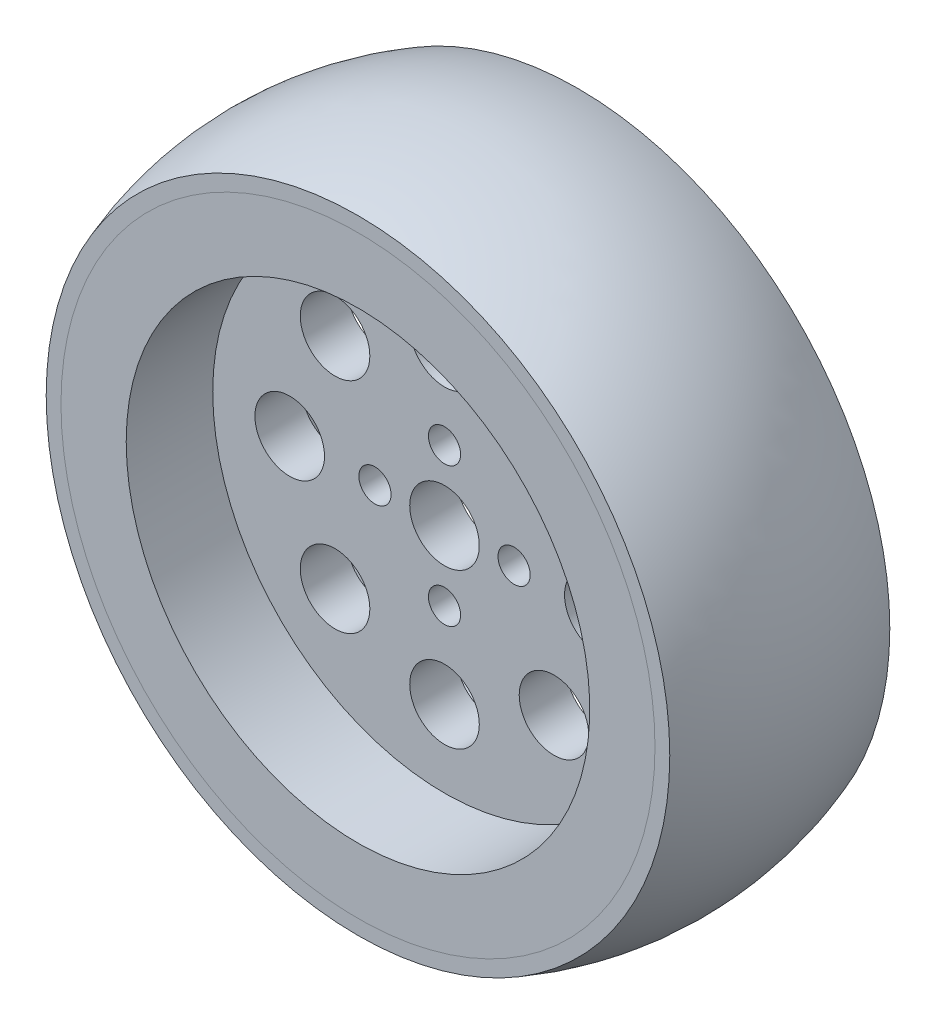
ISO-10303-21;
HEADER;
FILE_DESCRIPTION(('STEP AP214'),'2;1');
FILE_NAME('part.step','',(''),(''),'','','');
FILE_SCHEMA(('AUTOMOTIVE_DESIGN { 1 0 10303 214 1 1 1 1 }'));
ENDSEC;
DATA;
#1=APPLICATION_CONTEXT('core data for automotive mechanical design processes');
#2=APPLICATION_PROTOCOL_DEFINITION('international standard','automotive_design',2000,#1);
#3=PRODUCT_CONTEXT('',#1,'mechanical');
#4=PRODUCT('Part','Part','',(#3));
#5=PRODUCT_RELATED_PRODUCT_CATEGORY('part','',(#4));
#6=PRODUCT_DEFINITION_FORMATION('','',#4);
#7=PRODUCT_DEFINITION_CONTEXT('part definition',#1,'design');
#8=PRODUCT_DEFINITION('design','',#6,#7);
#9=PRODUCT_DEFINITION_SHAPE('','',#8);
#10=(LENGTH_UNIT() NAMED_UNIT(*) SI_UNIT(.MILLI.,.METRE.));
#11=(NAMED_UNIT(*) PLANE_ANGLE_UNIT() SI_UNIT($,.RADIAN.));
#12=(NAMED_UNIT(*) SI_UNIT($,.STERADIAN.) SOLID_ANGLE_UNIT());
#13=UNCERTAINTY_MEASURE_WITH_UNIT(LENGTH_MEASURE(1.E-05),#10,'distance_accuracy_value','');
#14=(GEOMETRIC_REPRESENTATION_CONTEXT(3) GLOBAL_UNCERTAINTY_ASSIGNED_CONTEXT((#13)) GLOBAL_UNIT_ASSIGNED_CONTEXT((#10,
#11,#12)) REPRESENTATION_CONTEXT('',''));
#15=CARTESIAN_POINT('',(0.,0.,0.));
#16=DIRECTION('',(0.,0.,1.));
#17=DIRECTION('',(1.,0.,0.));
#18=AXIS2_PLACEMENT_3D('',#15,#16,#17);
#19=CARTESIAN_POINT('',(34.15,0.,10.65));
#20=DIRECTION('',(0.,0.,-1.));
#21=DIRECTION('',(-1.,0.,0.));
#22=AXIS2_PLACEMENT_3D('',#19,#20,#21);
#23=PLANE('',#22);
#24=CARTESIAN_POINT('',(0.,0.,10.65));
#25=DIRECTION('',(0.,0.,-1.));
#26=DIRECTION('',(-1.,0.,0.));
#27=AXIS2_PLACEMENT_3D('',#24,#25,#26);
#28=CIRCLE('',#27,34.15);
#29=CARTESIAN_POINT('',(-34.15,0.,10.65));
#30=VERTEX_POINT('',#29);
#31=EDGE_CURVE('E68',#30,#30,#28,.T.);
#32=ORIENTED_EDGE('',*,*,#31,.F.);
#33=EDGE_LOOP('',(#32));
#34=FACE_BOUND('',#33,.T.);
#35=CARTESIAN_POINT('',(0.,0.,10.65));
#36=DIRECTION('',(0.,0.,-1.));
#37=DIRECTION('',(-1.,0.,0.));
#38=AXIS2_PLACEMENT_3D('',#35,#36,#37);
#39=CIRCLE('',#38,31.85);
#40=CARTESIAN_POINT('',(-31.85,0.,10.65));
#41=VERTEX_POINT('',#40);
#42=EDGE_CURVE('E11',#41,#41,#39,.T.);
#43=ORIENTED_EDGE('',*,*,#42,.T.);
#44=EDGE_LOOP('',(#43));
#45=FACE_BOUND('',#44,.T.);
#46=ADVANCED_FACE('F40',(#34,#45),#23,.F.);
#47=CARTESIAN_POINT('',(0.,0.,0.));
#48=DIRECTION('',(0.,0.,-1.));
#49=DIRECTION('',(-1.,0.,0.));
#50=AXIS2_PLACEMENT_3D('',#47,#48,#49);
#51=CYLINDRICAL_SURFACE('',#50,31.85);
#52=ORIENTED_EDGE('',*,*,#42,.F.);
#53=EDGE_LOOP('',(#52));
#54=FACE_BOUND('',#53,.T.);
#55=CARTESIAN_POINT('',(0.,0.,-10.65));
#56=DIRECTION('',(0.,0.,-1.));
#57=DIRECTION('',(-1.,0.,0.));
#58=AXIS2_PLACEMENT_3D('',#55,#56,#57);
#59=CIRCLE('',#58,31.85);
#60=CARTESIAN_POINT('',(-31.85,0.,-10.65));
#61=VERTEX_POINT('',#60);
#62=EDGE_CURVE('E46',#61,#61,#59,.T.);
#63=ORIENTED_EDGE('',*,*,#62,.T.);
#64=EDGE_LOOP('',(#63));
#65=FACE_BOUND('',#64,.T.);
#66=ADVANCED_FACE('F75',(#54,#65),#51,.F.);
#67=CARTESIAN_POINT('',(31.85,0.,-10.65));
#68=DIRECTION('',(0.,0.,1.));
#69=DIRECTION('',(1.,0.,0.));
#70=AXIS2_PLACEMENT_3D('',#67,#68,#69);
#71=PLANE('',#70);
#72=ORIENTED_EDGE('',*,*,#62,.F.);
#73=EDGE_LOOP('',(#72));
#74=FACE_BOUND('',#73,.T.);
#75=CARTESIAN_POINT('',(0.,0.,-10.65));
#76=DIRECTION('',(0.,0.,-1.));
#77=DIRECTION('',(-1.,0.,0.));
#78=AXIS2_PLACEMENT_3D('',#75,#76,#77);
#79=CIRCLE('',#78,34.15);
#80=CARTESIAN_POINT('',(-34.15,0.,-10.65));
#81=VERTEX_POINT('',#80);
#82=EDGE_CURVE('E50',#81,#81,#79,.T.);
#83=ORIENTED_EDGE('',*,*,#82,.T.);
#84=EDGE_LOOP('',(#83));
#85=FACE_BOUND('',#84,.T.);
#86=ADVANCED_FACE('F79',(#74,#85),#71,.F.);
#87=CARTESIAN_POINT('',(0.,0.,0.));
#88=DIRECTION('',(0.,0.,-1.));
#89=DIRECTION('',(-1.,0.,0.));
#90=AXIS2_PLACEMENT_3D('',#87,#88,#89);
#91=CYLINDRICAL_SURFACE('',#90,34.15);
#92=ORIENTED_EDGE('',*,*,#82,.F.);
#93=EDGE_LOOP('',(#92));
#94=FACE_BOUND('',#93,.T.);
#95=CARTESIAN_POINT('',(0.,0.,-12.65));
#96=DIRECTION('',(0.,0.,-1.));
#97=DIRECTION('',(-1.,0.,0.));
#98=AXIS2_PLACEMENT_3D('',#95,#96,#97);
#99=CIRCLE('',#98,34.15);
#100=CARTESIAN_POINT('',(-34.15,0.,-12.65));
#101=VERTEX_POINT('',#100);
#102=EDGE_CURVE('E54',#101,#101,#99,.T.);
#103=ORIENTED_EDGE('',*,*,#102,.T.);
#104=EDGE_LOOP('',(#103));
#105=FACE_BOUND('',#104,.T.);
#106=ADVANCED_FACE('F84',(#94,#105),#91,.F.);
#107=CARTESIAN_POINT('',(34.15,0.,-12.65));
#108=DIRECTION('',(0.,0.,1.));
#109=DIRECTION('',(1.,0.,0.));
#110=AXIS2_PLACEMENT_3D('',#107,#108,#109);
#111=PLANE('',#110);
#112=ORIENTED_EDGE('',*,*,#102,.F.);
#113=EDGE_LOOP('',(#112));
#114=FACE_BOUND('',#113,.T.);
#115=CARTESIAN_POINT('',(0.,0.,-12.65));
#116=DIRECTION('',(0.,0.,-1.));
#117=DIRECTION('',(-1.,0.,0.));
#118=AXIS2_PLACEMENT_3D('',#115,#116,#117);
#119=CIRCLE('',#118,35.85);
#120=CARTESIAN_POINT('',(-35.85,0.,-12.65));
#121=VERTEX_POINT('',#120);
#122=EDGE_CURVE('E59',#121,#121,#119,.T.);
#123=ORIENTED_EDGE('',*,*,#122,.T.);
#124=EDGE_LOOP('',(#123));
#125=FACE_BOUND('',#124,.T.);
#126=ADVANCED_FACE('F90',(#114,#125),#111,.F.);
#127=CARTESIAN_POINT('',(0.,0.,0.));
#128=DIRECTION('',(0.,0.,-1.));
#129=DIRECTION('',(-1.,0.,0.));
#130=AXIS2_PLACEMENT_3D('',#127,#128,#129);
#131=DEGENERATE_TOROIDAL_SURFACE('',#130,1.41444444444449,36.6855555555555,.T.);
#132=ORIENTED_EDGE('',*,*,#122,.F.);
#133=EDGE_LOOP('',(#132));
#134=FACE_BOUND('',#133,.T.);
#135=CARTESIAN_POINT('',(0.,0.,12.65));
#136=DIRECTION('',(0.,0.,-1.));
#137=DIRECTION('',(-1.,0.,0.));
#138=AXIS2_PLACEMENT_3D('',#135,#136,#137);
#139=CIRCLE('',#138,35.85);
#140=CARTESIAN_POINT('',(-35.85,0.,12.65));
#141=VERTEX_POINT('',#140);
#142=EDGE_CURVE('E62',#141,#141,#139,.T.);
#143=ORIENTED_EDGE('',*,*,#142,.T.);
#144=EDGE_LOOP('',(#143));
#145=FACE_BOUND('',#144,.T.);
#146=ADVANCED_FACE('F94',(#134,#145),#131,.T.);
#147=CARTESIAN_POINT('',(34.15,0.,12.65));
#148=DIRECTION('',(0.,0.,-1.));
#149=DIRECTION('',(-1.,0.,0.));
#150=AXIS2_PLACEMENT_3D('',#147,#148,#149);
#151=PLANE('',#150);
#152=ORIENTED_EDGE('',*,*,#142,.F.);
#153=EDGE_LOOP('',(#152));
#154=FACE_BOUND('',#153,.T.);
#155=CARTESIAN_POINT('',(0.,0.,12.65));
#156=DIRECTION('',(0.,0.,-1.));
#157=DIRECTION('',(-1.,0.,0.));
#158=AXIS2_PLACEMENT_3D('',#155,#156,#157);
#159=CIRCLE('',#158,34.15);
#160=CARTESIAN_POINT('',(-34.15,0.,12.65));
#161=VERTEX_POINT('',#160);
#162=EDGE_CURVE('E65',#161,#161,#159,.T.);
#163=ORIENTED_EDGE('',*,*,#162,.T.);
#164=EDGE_LOOP('',(#163));
#165=FACE_BOUND('',#164,.T.);
#166=ADVANCED_FACE('F98',(#154,#165),#151,.F.);
#167=CARTESIAN_POINT('',(0.,0.,0.));
#168=DIRECTION('',(0.,0.,-1.));
#169=DIRECTION('',(-1.,0.,0.));
#170=AXIS2_PLACEMENT_3D('',#167,#168,#169);
#171=CYLINDRICAL_SURFACE('',#170,34.15);
#172=ORIENTED_EDGE('',*,*,#162,.F.);
#173=EDGE_LOOP('',(#172));
#174=FACE_BOUND('',#173,.T.);
#175=ORIENTED_EDGE('',*,*,#31,.T.);
#176=EDGE_LOOP('',(#175));
#177=FACE_BOUND('',#176,.T.);
#178=ADVANCED_FACE('F72',(#174,#177),#171,.F.);
#179=CLOSED_SHELL('',(#46,#66,#86,#106,#126,#146,#166,#178));
#180=MANIFOLD_SOLID_BREP('B2',#179);
#181=CARTESIAN_POINT('',(26.65,0.,-2.7));
#182=DIRECTION('',(0.,0.,1.));
#183=DIRECTION('',(1.,0.,0.));
#184=AXIS2_PLACEMENT_3D('',#181,#182,#183);
#185=PLANE('',#184);
#186=CARTESIAN_POINT('',(-12.5865007051206,12.5865007051205,-2.69999999999999));
#187=DIRECTION('',(0.,0.,1.));
#188=DIRECTION('',(1.,0.,0.));
#189=AXIS2_PLACEMENT_3D('',#186,#187,#188);
#190=CIRCLE('',#189,4.);
#191=CARTESIAN_POINT('',(-8.58650070512062,12.5865007051205,-2.69999999999999));
#192=VERTEX_POINT('',#191);
#193=EDGE_CURVE('E219',#192,#192,#190,.T.);
#194=ORIENTED_EDGE('',*,*,#193,.T.);
#195=EDGE_LOOP('',(#194));
#196=FACE_BOUND('',#195,.T.);
#197=CARTESIAN_POINT('',(-17.8,0.,-2.69999999999999));
#198=DIRECTION('',(0.,0.,1.));
#199=DIRECTION('',(1.,0.,0.));
#200=AXIS2_PLACEMENT_3D('',#197,#198,#199);
#201=CIRCLE('',#200,4.);
#202=CARTESIAN_POINT('',(-13.8,0.,-2.69999999999999));
#203=VERTEX_POINT('',#202);
#204=EDGE_CURVE('E216',#203,#203,#201,.T.);
#205=ORIENTED_EDGE('',*,*,#204,.T.);
#206=EDGE_LOOP('',(#205));
#207=FACE_BOUND('',#206,.T.);
#208=CARTESIAN_POINT('',(-12.5865007051205,-12.5865007051206,-2.69999999999999));
#209=DIRECTION('',(0.,0.,1.));
#210=DIRECTION('',(1.,0.,0.));
#211=AXIS2_PLACEMENT_3D('',#208,#209,#210);
#212=CIRCLE('',#211,4.);
#213=CARTESIAN_POINT('',(-8.58650070512048,-12.5865007051206,-2.69999999999999));
#214=VERTEX_POINT('',#213);
#215=EDGE_CURVE('E213',#214,#214,#212,.T.);
#216=ORIENTED_EDGE('',*,*,#215,.T.);
#217=EDGE_LOOP('',(#216));
#218=FACE_BOUND('',#217,.T.);
#219=CARTESIAN_POINT('',(0.,-17.8,-2.69999999999999));
#220=DIRECTION('',(0.,0.,1.));
#221=DIRECTION('',(1.,0.,0.));
#222=AXIS2_PLACEMENT_3D('',#219,#220,#221);
#223=CIRCLE('',#222,4.);
#224=CARTESIAN_POINT('',(4.,-17.8,-2.7));
#225=VERTEX_POINT('',#224);
#226=EDGE_CURVE('E209',#225,#225,#223,.T.);
#227=ORIENTED_EDGE('',*,*,#226,.T.);
#228=EDGE_LOOP('',(#227));
#229=FACE_BOUND('',#228,.T.);
#230=CARTESIAN_POINT('',(12.5865007051206,-12.5865007051205,-2.7));
#231=DIRECTION('',(0.,0.,1.));
#232=DIRECTION('',(1.,0.,0.));
#233=AXIS2_PLACEMENT_3D('',#230,#231,#232);
#234=CIRCLE('',#233,4.);
#235=CARTESIAN_POINT('',(16.5865007051206,-12.5865007051205,-2.7));
#236=VERTEX_POINT('',#235);
#237=EDGE_CURVE('E205',#236,#236,#234,.T.);
#238=ORIENTED_EDGE('',*,*,#237,.T.);
#239=EDGE_LOOP('',(#238));
#240=FACE_BOUND('',#239,.T.);
#241=CARTESIAN_POINT('',(17.8,0.,-2.7));
#242=DIRECTION('',(0.,0.,1.));
#243=DIRECTION('',(1.,0.,0.));
#244=AXIS2_PLACEMENT_3D('',#241,#242,#243);
#245=CIRCLE('',#244,4.);
#246=CARTESIAN_POINT('',(21.8,0.,-2.7));
#247=VERTEX_POINT('',#246);
#248=EDGE_CURVE('E201',#247,#247,#245,.T.);
#249=ORIENTED_EDGE('',*,*,#248,.T.);
#250=EDGE_LOOP('',(#249));
#251=FACE_BOUND('',#250,.T.);
#252=CARTESIAN_POINT('',(12.5865007051205,12.5865007051206,-2.7));
#253=DIRECTION('',(0.,0.,1.));
#254=DIRECTION('',(1.,0.,0.));
#255=AXIS2_PLACEMENT_3D('',#252,#253,#254);
#256=CIRCLE('',#255,3.99999999999999);
#257=CARTESIAN_POINT('',(16.5865007051205,12.5865007051206,-2.7));
#258=VERTEX_POINT('',#257);
#259=EDGE_CURVE('E197',#258,#258,#256,.T.);
#260=ORIENTED_EDGE('',*,*,#259,.T.);
#261=EDGE_LOOP('',(#260));
#262=FACE_BOUND('',#261,.T.);
#263=CARTESIAN_POINT('',(0.,17.8,-2.69999999999999));
#264=DIRECTION('',(0.,0.,1.));
#265=DIRECTION('',(1.,0.,0.));
#266=AXIS2_PLACEMENT_3D('',#263,#264,#265);
#267=CIRCLE('',#266,4.);
#268=CARTESIAN_POINT('',(4.,17.8,-2.7));
#269=VERTEX_POINT('',#268);
#270=EDGE_CURVE('E193',#269,#269,#267,.T.);
#271=ORIENTED_EDGE('',*,*,#270,.T.);
#272=EDGE_LOOP('',(#271));
#273=FACE_BOUND('',#272,.T.);
#274=CARTESIAN_POINT('',(-8.,0.,-2.69999999999999));
#275=DIRECTION('',(0.,0.,1.));
#276=DIRECTION('',(1.,0.,0.));
#277=AXIS2_PLACEMENT_3D('',#274,#275,#276);
#278=CIRCLE('',#277,1.85);
#279=CARTESIAN_POINT('',(-6.15,0.,-2.69999999999999));
#280=VERTEX_POINT('',#279);
#281=EDGE_CURVE('E189',#280,#280,#278,.T.);
#282=ORIENTED_EDGE('',*,*,#281,.T.);
#283=EDGE_LOOP('',(#282));
#284=FACE_BOUND('',#283,.T.);
#285=CARTESIAN_POINT('',(0.,-8.,-2.69999999999999));
#286=DIRECTION('',(0.,0.,1.));
#287=DIRECTION('',(1.,0.,0.));
#288=AXIS2_PLACEMENT_3D('',#285,#286,#287);
#289=CIRCLE('',#288,1.85);
#290=CARTESIAN_POINT('',(1.85,-8.,-2.69999999999999));
#291=VERTEX_POINT('',#290);
#292=EDGE_CURVE('E185',#291,#291,#289,.T.);
#293=ORIENTED_EDGE('',*,*,#292,.T.);
#294=EDGE_LOOP('',(#293));
#295=FACE_BOUND('',#294,.T.);
#296=CARTESIAN_POINT('',(8.,0.,-2.7));
#297=DIRECTION('',(0.,0.,1.));
#298=DIRECTION('',(1.,0.,0.));
#299=AXIS2_PLACEMENT_3D('',#296,#297,#298);
#300=CIRCLE('',#299,1.85);
#301=CARTESIAN_POINT('',(9.85,0.,-2.7));
#302=VERTEX_POINT('',#301);
#303=EDGE_CURVE('E181',#302,#302,#300,.T.);
#304=ORIENTED_EDGE('',*,*,#303,.T.);
#305=EDGE_LOOP('',(#304));
#306=FACE_BOUND('',#305,.T.);
#307=CARTESIAN_POINT('',(0.,8.,-2.69999999999999));
#308=DIRECTION('',(0.,0.,1.));
#309=DIRECTION('',(1.,0.,0.));
#310=AXIS2_PLACEMENT_3D('',#307,#308,#309);
#311=CIRCLE('',#310,1.85);
#312=CARTESIAN_POINT('',(1.85,8.,-2.69999999999999));
#313=VERTEX_POINT('',#312);
#314=EDGE_CURVE('E180',#313,#313,#311,.T.);
#315=ORIENTED_EDGE('',*,*,#314,.T.);
#316=EDGE_LOOP('',(#315));
#317=FACE_BOUND('',#316,.T.);
#318=CARTESIAN_POINT('',(0.,0.,-2.7));
#319=DIRECTION('',(0.,0.,-1.));
#320=DIRECTION('',(-1.,0.,0.));
#321=AXIS2_PLACEMENT_3D('',#318,#319,#320);
#322=CIRCLE('',#321,4.);
#323=CARTESIAN_POINT('',(-4.00000000000001,0.,-2.69999999999999));
#324=VERTEX_POINT('',#323);
#325=EDGE_CURVE('E39',#324,#324,#322,.T.);
#326=ORIENTED_EDGE('',*,*,#325,.F.);
#327=EDGE_LOOP('',(#326));
#328=FACE_BOUND('',#327,.T.);
#329=CARTESIAN_POINT('',(0.,0.,-2.69999999999999));
#330=DIRECTION('',(0.,0.,-1.));
#331=DIRECTION('',(-1.,0.,0.));
#332=AXIS2_PLACEMENT_3D('',#329,#330,#331);
#333=CIRCLE('',#332,26.65);
#334=CARTESIAN_POINT('',(-26.65,0.,-2.69999999999998));
#335=VERTEX_POINT('',#334);
#336=EDGE_CURVE('E250',#335,#335,#333,.T.);
#337=ORIENTED_EDGE('',*,*,#336,.T.);
#338=EDGE_LOOP('',(#337));
#339=FACE_BOUND('',#338,.T.);
#340=ADVANCED_FACE('F161',(#196,#207,#218,#229,#240,#251,#262,#273,#284,#295,#306,#317,#328,
#339),#185,.F.);
#341=CARTESIAN_POINT('',(0.,0.,-12.65));
#342=DIRECTION('',(0.,0.,-1.));
#343=DIRECTION('',(-1.,0.,0.));
#344=AXIS2_PLACEMENT_3D('',#341,#342,#343);
#345=CYLINDRICAL_SURFACE('',#344,4.);
#346=CARTESIAN_POINT('',(0.,0.,2.7));
#347=DIRECTION('',(0.,0.,-1.));
#348=DIRECTION('',(-1.,0.,0.));
#349=AXIS2_PLACEMENT_3D('',#346,#347,#348);
#350=CIRCLE('',#349,4.);
#351=CARTESIAN_POINT('',(-4.,0.,2.7));
#352=VERTEX_POINT('',#351);
#353=EDGE_CURVE('E168',#352,#352,#350,.T.);
#354=ORIENTED_EDGE('',*,*,#353,.F.);
#355=EDGE_LOOP('',(#354));
#356=FACE_BOUND('',#355,.T.);
#357=ORIENTED_EDGE('',*,*,#325,.T.);
#358=EDGE_LOOP('',(#357));
#359=FACE_BOUND('',#358,.T.);
#360=ADVANCED_FACE('F284',(#356,#359),#345,.F.);
#361=CARTESIAN_POINT('',(4.,0.,2.7));
#362=DIRECTION('',(0.,0.,-1.));
#363=DIRECTION('',(-1.,0.,0.));
#364=AXIS2_PLACEMENT_3D('',#361,#362,#363);
#365=PLANE('',#364);
#366=CARTESIAN_POINT('',(-12.5865007051206,12.5865007051205,2.70000000000001));
#367=DIRECTION('',(0.,0.,-1.));
#368=DIRECTION('',(-1.,0.,0.));
#369=AXIS2_PLACEMENT_3D('',#366,#367,#368);
#370=CIRCLE('',#369,4.);
#371=CARTESIAN_POINT('',(-16.5865007051206,12.5865007051205,2.70000000000001));
#372=VERTEX_POINT('',#371);
#373=EDGE_CURVE('E164',#372,#372,#370,.T.);
#374=ORIENTED_EDGE('',*,*,#373,.T.);
#375=EDGE_LOOP('',(#374));
#376=FACE_BOUND('',#375,.T.);
#377=CARTESIAN_POINT('',(-17.8,0.,2.70000000000001));
#378=DIRECTION('',(0.,0.,-1.));
#379=DIRECTION('',(-1.,0.,0.));
#380=AXIS2_PLACEMENT_3D('',#377,#378,#379);
#381=CIRCLE('',#380,4.);
#382=CARTESIAN_POINT('',(-21.8,0.,2.70000000000001));
#383=VERTEX_POINT('',#382);
#384=EDGE_CURVE('E217',#383,#383,#381,.T.);
#385=ORIENTED_EDGE('',*,*,#384,.T.);
#386=EDGE_LOOP('',(#385));
#387=FACE_BOUND('',#386,.T.);
#388=CARTESIAN_POINT('',(-12.5865007051205,-12.5865007051206,2.70000000000001));
#389=DIRECTION('',(0.,0.,-1.));
#390=DIRECTION('',(-1.,0.,0.));
#391=AXIS2_PLACEMENT_3D('',#388,#389,#390);
#392=CIRCLE('',#391,4.);
#393=CARTESIAN_POINT('',(-16.5865007051205,-12.5865007051206,2.70000000000001));
#394=VERTEX_POINT('',#393);
#395=EDGE_CURVE('E214',#394,#394,#392,.T.);
#396=ORIENTED_EDGE('',*,*,#395,.T.);
#397=EDGE_LOOP('',(#396));
#398=FACE_BOUND('',#397,.T.);
#399=CARTESIAN_POINT('',(0.,-17.8,2.7));
#400=DIRECTION('',(0.,0.,-1.));
#401=DIRECTION('',(-1.,0.,0.));
#402=AXIS2_PLACEMENT_3D('',#399,#400,#401);
#403=CIRCLE('',#402,4.);
#404=CARTESIAN_POINT('',(-4.,-17.8,2.70000000000001));
#405=VERTEX_POINT('',#404);
#406=EDGE_CURVE('E210',#405,#405,#403,.T.);
#407=ORIENTED_EDGE('',*,*,#406,.T.);
#408=EDGE_LOOP('',(#407));
#409=FACE_BOUND('',#408,.T.);
#410=CARTESIAN_POINT('',(12.5865007051206,-12.5865007051205,2.7));
#411=DIRECTION('',(0.,0.,-1.));
#412=DIRECTION('',(-1.,0.,0.));
#413=AXIS2_PLACEMENT_3D('',#410,#411,#412);
#414=CIRCLE('',#413,4.);
#415=CARTESIAN_POINT('',(8.58650070512061,-12.5865007051205,2.7));
#416=VERTEX_POINT('',#415);
#417=EDGE_CURVE('E206',#416,#416,#414,.T.);
#418=ORIENTED_EDGE('',*,*,#417,.T.);
#419=EDGE_LOOP('',(#418));
#420=FACE_BOUND('',#419,.T.);
#421=CARTESIAN_POINT('',(17.8,0.,2.7));
#422=DIRECTION('',(0.,0.,-1.));
#423=DIRECTION('',(-1.,0.,0.));
#424=AXIS2_PLACEMENT_3D('',#421,#422,#423);
#425=CIRCLE('',#424,4.);
#426=CARTESIAN_POINT('',(13.8,0.,2.7));
#427=VERTEX_POINT('',#426);
#428=EDGE_CURVE('E202',#427,#427,#425,.T.);
#429=ORIENTED_EDGE('',*,*,#428,.T.);
#430=EDGE_LOOP('',(#429));
#431=FACE_BOUND('',#430,.T.);
#432=CARTESIAN_POINT('',(12.5865007051205,12.5865007051206,2.7));
#433=DIRECTION('',(0.,0.,-1.));
#434=DIRECTION('',(-1.,0.,0.));
#435=AXIS2_PLACEMENT_3D('',#432,#433,#434);
#436=CIRCLE('',#435,3.99999999999999);
#437=CARTESIAN_POINT('',(8.58650070512047,12.5865007051206,2.7));
#438=VERTEX_POINT('',#437);
#439=EDGE_CURVE('E198',#438,#438,#436,.T.);
#440=ORIENTED_EDGE('',*,*,#439,.T.);
#441=EDGE_LOOP('',(#440));
#442=FACE_BOUND('',#441,.T.);
#443=CARTESIAN_POINT('',(0.,17.8,2.7));
#444=DIRECTION('',(0.,0.,-1.));
#445=DIRECTION('',(-1.,0.,0.));
#446=AXIS2_PLACEMENT_3D('',#443,#444,#445);
#447=CIRCLE('',#446,4.);
#448=CARTESIAN_POINT('',(-4.,17.8,2.70000000000001));
#449=VERTEX_POINT('',#448);
#450=EDGE_CURVE('E194',#449,#449,#447,.T.);
#451=ORIENTED_EDGE('',*,*,#450,.T.);
#452=EDGE_LOOP('',(#451));
#453=FACE_BOUND('',#452,.T.);
#454=CARTESIAN_POINT('',(-8.,0.,2.70000000000001));
#455=DIRECTION('',(0.,0.,-1.));
#456=DIRECTION('',(-1.,0.,0.));
#457=AXIS2_PLACEMENT_3D('',#454,#455,#456);
#458=CIRCLE('',#457,1.85);
#459=CARTESIAN_POINT('',(-9.85,0.,2.70000000000001));
#460=VERTEX_POINT('',#459);
#461=EDGE_CURVE('E190',#460,#460,#458,.T.);
#462=ORIENTED_EDGE('',*,*,#461,.T.);
#463=EDGE_LOOP('',(#462));
#464=FACE_BOUND('',#463,.T.);
#465=CARTESIAN_POINT('',(0.,-8.,2.7));
#466=DIRECTION('',(0.,0.,-1.));
#467=DIRECTION('',(-1.,0.,0.));
#468=AXIS2_PLACEMENT_3D('',#465,#466,#467);
#469=CIRCLE('',#468,1.85);
#470=CARTESIAN_POINT('',(-1.85,-8.,2.70000000000001));
#471=VERTEX_POINT('',#470);
#472=EDGE_CURVE('E186',#471,#471,#469,.T.);
#473=ORIENTED_EDGE('',*,*,#472,.T.);
#474=EDGE_LOOP('',(#473));
#475=FACE_BOUND('',#474,.T.);
#476=CARTESIAN_POINT('',(8.,0.,2.7));
#477=DIRECTION('',(0.,0.,-1.));
#478=DIRECTION('',(-1.,0.,0.));
#479=AXIS2_PLACEMENT_3D('',#476,#477,#478);
#480=CIRCLE('',#479,1.85);
#481=CARTESIAN_POINT('',(6.15,0.,2.7));
#482=VERTEX_POINT('',#481);
#483=EDGE_CURVE('E182',#482,#482,#480,.T.);
#484=ORIENTED_EDGE('',*,*,#483,.T.);
#485=EDGE_LOOP('',(#484));
#486=FACE_BOUND('',#485,.T.);
#487=CARTESIAN_POINT('',(0.,8.,2.7));
#488=DIRECTION('',(0.,0.,-1.));
#489=DIRECTION('',(-1.,0.,0.));
#490=AXIS2_PLACEMENT_3D('',#487,#488,#489);
#491=CIRCLE('',#490,1.85);
#492=CARTESIAN_POINT('',(-1.85,8.,2.70000000000001));
#493=VERTEX_POINT('',#492);
#494=EDGE_CURVE('E177',#493,#493,#491,.T.);
#495=ORIENTED_EDGE('',*,*,#494,.T.);
#496=EDGE_LOOP('',(#495));
#497=FACE_BOUND('',#496,.T.);
#498=CARTESIAN_POINT('',(0.,0.,2.70000000000001));
#499=DIRECTION('',(0.,0.,-1.));
#500=DIRECTION('',(-1.,0.,0.));
#501=AXIS2_PLACEMENT_3D('',#498,#499,#500);
#502=CIRCLE('',#501,26.65);
#503=CARTESIAN_POINT('',(-26.65,0.,2.70000000000002));
#504=VERTEX_POINT('',#503);
#505=EDGE_CURVE('E173',#504,#504,#502,.T.);
#506=ORIENTED_EDGE('',*,*,#505,.F.);
#507=EDGE_LOOP('',(#506));
#508=FACE_BOUND('',#507,.T.);
#509=ORIENTED_EDGE('',*,*,#353,.T.);
#510=EDGE_LOOP('',(#509));
#511=FACE_BOUND('',#510,.T.);
#512=ADVANCED_FACE('F281',(#376,#387,#398,#409,#420,#431,#442,#453,#464,#475,#486,#497,#508,
#511),#365,.F.);
#513=CARTESIAN_POINT('',(0.,0.,-12.65));
#514=DIRECTION('',(0.,0.,-1.));
#515=DIRECTION('',(-1.,0.,0.));
#516=AXIS2_PLACEMENT_3D('',#513,#514,#515);
#517=CYLINDRICAL_SURFACE('',#516,26.65);
#518=CARTESIAN_POINT('',(0.,0.,12.65));
#519=DIRECTION('',(0.,0.,-1.));
#520=DIRECTION('',(-1.,0.,0.));
#521=AXIS2_PLACEMENT_3D('',#518,#519,#520);
#522=CIRCLE('',#521,26.65);
#523=CARTESIAN_POINT('',(-26.65,0.,12.65));
#524=VERTEX_POINT('',#523);
#525=EDGE_CURVE('E274',#524,#524,#522,.T.);
#526=ORIENTED_EDGE('',*,*,#525,.F.);
#527=EDGE_LOOP('',(#526));
#528=FACE_BOUND('',#527,.T.);
#529=ORIENTED_EDGE('',*,*,#505,.T.);
#530=EDGE_LOOP('',(#529));
#531=FACE_BOUND('',#530,.T.);
#532=ADVANCED_FACE('F279',(#528,#531),#517,.F.);
#533=CARTESIAN_POINT('',(26.65,0.,12.65));
#534=DIRECTION('',(0.,0.,-1.));
#535=DIRECTION('',(-1.,0.,0.));
#536=AXIS2_PLACEMENT_3D('',#533,#534,#535);
#537=PLANE('',#536);
#538=CARTESIAN_POINT('',(0.,0.,12.65));
#539=DIRECTION('',(0.,0.,-1.));
#540=DIRECTION('',(-1.,0.,0.));
#541=AXIS2_PLACEMENT_3D('',#538,#539,#540);
#542=CIRCLE('',#541,34.15);
#543=CARTESIAN_POINT('',(-34.15,0.,12.65));
#544=VERTEX_POINT('',#543);
#545=EDGE_CURVE('E271',#544,#544,#542,.T.);
#546=ORIENTED_EDGE('',*,*,#545,.F.);
#547=EDGE_LOOP('',(#546));
#548=FACE_BOUND('',#547,.T.);
#549=ORIENTED_EDGE('',*,*,#525,.T.);
#550=EDGE_LOOP('',(#549));
#551=FACE_BOUND('',#550,.T.);
#552=ADVANCED_FACE('F296',(#548,#551),#537,.F.);
#553=CARTESIAN_POINT('',(0.,0.,-12.65));
#554=DIRECTION('',(0.,0.,-1.));
#555=DIRECTION('',(-1.,0.,0.));
#556=AXIS2_PLACEMENT_3D('',#553,#554,#555);
#557=CYLINDRICAL_SURFACE('',#556,34.15);
#558=CARTESIAN_POINT('',(0.,0.,10.65));
#559=DIRECTION('',(0.,0.,-1.));
#560=DIRECTION('',(-1.,0.,0.));
#561=AXIS2_PLACEMENT_3D('',#558,#559,#560);
#562=CIRCLE('',#561,34.15);
#563=CARTESIAN_POINT('',(-34.15,0.,10.65));
#564=VERTEX_POINT('',#563);
#565=EDGE_CURVE('E268',#564,#564,#562,.T.);
#566=ORIENTED_EDGE('',*,*,#565,.F.);
#567=EDGE_LOOP('',(#566));
#568=FACE_BOUND('',#567,.T.);
#569=ORIENTED_EDGE('',*,*,#545,.T.);
#570=EDGE_LOOP('',(#569));
#571=FACE_BOUND('',#570,.T.);
#572=ADVANCED_FACE('F300',(#568,#571),#557,.T.);
#573=CARTESIAN_POINT('',(34.15,0.,10.65));
#574=DIRECTION('',(0.,0.,1.));
#575=DIRECTION('',(1.,0.,0.));
#576=AXIS2_PLACEMENT_3D('',#573,#574,#575);
#577=PLANE('',#576);
#578=CARTESIAN_POINT('',(0.,0.,10.65));
#579=DIRECTION('',(0.,0.,-1.));
#580=DIRECTION('',(-1.,0.,0.));
#581=AXIS2_PLACEMENT_3D('',#578,#579,#580);
#582=CIRCLE('',#581,31.85);
#583=CARTESIAN_POINT('',(-31.85,0.,10.65));
#584=VERTEX_POINT('',#583);
#585=EDGE_CURVE('E265',#584,#584,#582,.T.);
#586=ORIENTED_EDGE('',*,*,#585,.F.);
#587=EDGE_LOOP('',(#586));
#588=FACE_BOUND('',#587,.T.);
#589=ORIENTED_EDGE('',*,*,#565,.T.);
#590=EDGE_LOOP('',(#589));
#591=FACE_BOUND('',#590,.T.);
#592=ADVANCED_FACE('F304',(#588,#591),#577,.F.);
#593=CARTESIAN_POINT('',(0.,0.,-12.65));
#594=DIRECTION('',(0.,0.,-1.));
#595=DIRECTION('',(-1.,0.,0.));
#596=AXIS2_PLACEMENT_3D('',#593,#594,#595);
#597=CYLINDRICAL_SURFACE('',#596,31.85);
#598=CARTESIAN_POINT('',(0.,0.,-10.65));
#599=DIRECTION('',(0.,0.,-1.));
#600=DIRECTION('',(-1.,0.,0.));
#601=AXIS2_PLACEMENT_3D('',#598,#599,#600);
#602=CIRCLE('',#601,31.85);
#603=CARTESIAN_POINT('',(-31.85,0.,-10.65));
#604=VERTEX_POINT('',#603);
#605=EDGE_CURVE('E262',#604,#604,#602,.T.);
#606=ORIENTED_EDGE('',*,*,#605,.F.);
#607=EDGE_LOOP('',(#606));
#608=FACE_BOUND('',#607,.T.);
#609=ORIENTED_EDGE('',*,*,#585,.T.);
#610=EDGE_LOOP('',(#609));
#611=FACE_BOUND('',#610,.T.);
#612=ADVANCED_FACE('F308',(#608,#611),#597,.T.);
#613=CARTESIAN_POINT('',(31.85,0.,-10.65));
#614=DIRECTION('',(0.,0.,-1.));
#615=DIRECTION('',(-1.,0.,0.));
#616=AXIS2_PLACEMENT_3D('',#613,#614,#615);
#617=PLANE('',#616);
#618=CARTESIAN_POINT('',(0.,0.,-10.65));
#619=DIRECTION('',(0.,0.,-1.));
#620=DIRECTION('',(-1.,0.,0.));
#621=AXIS2_PLACEMENT_3D('',#618,#619,#620);
#622=CIRCLE('',#621,34.15);
#623=CARTESIAN_POINT('',(-34.15,0.,-10.65));
#624=VERTEX_POINT('',#623);
#625=EDGE_CURVE('E259',#624,#624,#622,.T.);
#626=ORIENTED_EDGE('',*,*,#625,.F.);
#627=EDGE_LOOP('',(#626));
#628=FACE_BOUND('',#627,.T.);
#629=ORIENTED_EDGE('',*,*,#605,.T.);
#630=EDGE_LOOP('',(#629));
#631=FACE_BOUND('',#630,.T.);
#632=ADVANCED_FACE('F312',(#628,#631),#617,.F.);
#633=CARTESIAN_POINT('',(0.,0.,-12.65));
#634=DIRECTION('',(0.,0.,-1.));
#635=DIRECTION('',(-1.,0.,0.));
#636=AXIS2_PLACEMENT_3D('',#633,#634,#635);
#637=CYLINDRICAL_SURFACE('',#636,34.15);
#638=CARTESIAN_POINT('',(0.,0.,-12.65));
#639=DIRECTION('',(0.,0.,-1.));
#640=DIRECTION('',(-1.,0.,0.));
#641=AXIS2_PLACEMENT_3D('',#638,#639,#640);
#642=CIRCLE('',#641,34.15);
#643=CARTESIAN_POINT('',(-34.15,0.,-12.65));
#644=VERTEX_POINT('',#643);
#645=EDGE_CURVE('E256',#644,#644,#642,.T.);
#646=ORIENTED_EDGE('',*,*,#645,.F.);
#647=EDGE_LOOP('',(#646));
#648=FACE_BOUND('',#647,.T.);
#649=ORIENTED_EDGE('',*,*,#625,.T.);
#650=EDGE_LOOP('',(#649));
#651=FACE_BOUND('',#650,.T.);
#652=ADVANCED_FACE('F316',(#648,#651),#637,.T.);
#653=CARTESIAN_POINT('',(34.15,0.,-12.65));
#654=DIRECTION('',(0.,0.,1.));
#655=DIRECTION('',(1.,0.,0.));
#656=AXIS2_PLACEMENT_3D('',#653,#654,#655);
#657=PLANE('',#656);
#658=CARTESIAN_POINT('',(0.,0.,-12.65));
#659=DIRECTION('',(0.,0.,-1.));
#660=DIRECTION('',(-1.,0.,0.));
#661=AXIS2_PLACEMENT_3D('',#658,#659,#660);
#662=CIRCLE('',#661,26.65);
#663=CARTESIAN_POINT('',(-26.65,0.,-12.65));
#664=VERTEX_POINT('',#663);
#665=EDGE_CURVE('E253',#664,#664,#662,.T.);
#666=ORIENTED_EDGE('',*,*,#665,.F.);
#667=EDGE_LOOP('',(#666));
#668=FACE_BOUND('',#667,.T.);
#669=ORIENTED_EDGE('',*,*,#645,.T.);
#670=EDGE_LOOP('',(#669));
#671=FACE_BOUND('',#670,.T.);
#672=ADVANCED_FACE('F320',(#668,#671),#657,.F.);
#673=CARTESIAN_POINT('',(0.,0.,-12.65));
#674=DIRECTION('',(0.,0.,-1.));
#675=DIRECTION('',(-1.,0.,0.));
#676=AXIS2_PLACEMENT_3D('',#673,#674,#675);
#677=CYLINDRICAL_SURFACE('',#676,26.65);
#678=ORIENTED_EDGE('',*,*,#336,.F.);
#679=EDGE_LOOP('',(#678));
#680=FACE_BOUND('',#679,.T.);
#681=ORIENTED_EDGE('',*,*,#665,.T.);
#682=EDGE_LOOP('',(#681));
#683=FACE_BOUND('',#682,.T.);
#684=ADVANCED_FACE('F324',(#680,#683),#677,.F.);
#685=CARTESIAN_POINT('',(0.,8.,-12.65));
#686=DIRECTION('',(0.,0.,1.));
#687=DIRECTION('',(1.,0.,0.));
#688=AXIS2_PLACEMENT_3D('',#685,#686,#687);
#689=CYLINDRICAL_SURFACE('',#688,1.85);
#690=ORIENTED_EDGE('',*,*,#494,.F.);
#691=EDGE_LOOP('',(#690));
#692=FACE_BOUND('',#691,.T.);
#693=ORIENTED_EDGE('',*,*,#314,.F.);
#694=EDGE_LOOP('',(#693));
#695=FACE_BOUND('',#694,.T.);
#696=ADVANCED_FACE('F328',(#692,#695),#689,.F.);
#697=CARTESIAN_POINT('',(8.,0.,-12.65));
#698=DIRECTION('',(0.,0.,1.));
#699=DIRECTION('',(1.,0.,0.));
#700=AXIS2_PLACEMENT_3D('',#697,#698,#699);
#701=CYLINDRICAL_SURFACE('',#700,1.85);
#702=ORIENTED_EDGE('',*,*,#483,.F.);
#703=EDGE_LOOP('',(#702));
#704=FACE_BOUND('',#703,.T.);
#705=ORIENTED_EDGE('',*,*,#303,.F.);
#706=EDGE_LOOP('',(#705));
#707=FACE_BOUND('',#706,.T.);
#708=ADVANCED_FACE('F332',(#704,#707),#701,.F.);
#709=CARTESIAN_POINT('',(0.,-8.,-12.65));
#710=DIRECTION('',(0.,0.,1.));
#711=DIRECTION('',(1.,0.,0.));
#712=AXIS2_PLACEMENT_3D('',#709,#710,#711);
#713=CYLINDRICAL_SURFACE('',#712,1.85);
#714=ORIENTED_EDGE('',*,*,#472,.F.);
#715=EDGE_LOOP('',(#714));
#716=FACE_BOUND('',#715,.T.);
#717=ORIENTED_EDGE('',*,*,#292,.F.);
#718=EDGE_LOOP('',(#717));
#719=FACE_BOUND('',#718,.T.);
#720=ADVANCED_FACE('F336',(#716,#719),#713,.F.);
#721=CARTESIAN_POINT('',(-8.,0.,-12.65));
#722=DIRECTION('',(0.,0.,1.));
#723=DIRECTION('',(1.,0.,0.));
#724=AXIS2_PLACEMENT_3D('',#721,#722,#723);
#725=CYLINDRICAL_SURFACE('',#724,1.85);
#726=ORIENTED_EDGE('',*,*,#461,.F.);
#727=EDGE_LOOP('',(#726));
#728=FACE_BOUND('',#727,.T.);
#729=ORIENTED_EDGE('',*,*,#281,.F.);
#730=EDGE_LOOP('',(#729));
#731=FACE_BOUND('',#730,.T.);
#732=ADVANCED_FACE('F340',(#728,#731),#725,.F.);
#733=CARTESIAN_POINT('',(0.,17.8,-12.65));
#734=DIRECTION('',(0.,0.,1.));
#735=DIRECTION('',(1.,0.,0.));
#736=AXIS2_PLACEMENT_3D('',#733,#734,#735);
#737=CYLINDRICAL_SURFACE('',#736,4.);
#738=ORIENTED_EDGE('',*,*,#450,.F.);
#739=EDGE_LOOP('',(#738));
#740=FACE_BOUND('',#739,.T.);
#741=ORIENTED_EDGE('',*,*,#270,.F.);
#742=EDGE_LOOP('',(#741));
#743=FACE_BOUND('',#742,.T.);
#744=ADVANCED_FACE('F344',(#740,#743),#737,.F.);
#745=CARTESIAN_POINT('',(12.5865007051205,12.5865007051206,-12.65));
#746=DIRECTION('',(0.,0.,1.));
#747=DIRECTION('',(1.,0.,0.));
#748=AXIS2_PLACEMENT_3D('',#745,#746,#747);
#749=CYLINDRICAL_SURFACE('',#748,3.99999999999999);
#750=ORIENTED_EDGE('',*,*,#439,.F.);
#751=EDGE_LOOP('',(#750));
#752=FACE_BOUND('',#751,.T.);
#753=ORIENTED_EDGE('',*,*,#259,.F.);
#754=EDGE_LOOP('',(#753));
#755=FACE_BOUND('',#754,.T.);
#756=ADVANCED_FACE('F348',(#752,#755),#749,.F.);
#757=CARTESIAN_POINT('',(17.8,0.,-12.65));
#758=DIRECTION('',(0.,0.,1.));
#759=DIRECTION('',(1.,0.,0.));
#760=AXIS2_PLACEMENT_3D('',#757,#758,#759);
#761=CYLINDRICAL_SURFACE('',#760,4.);
#762=ORIENTED_EDGE('',*,*,#428,.F.);
#763=EDGE_LOOP('',(#762));
#764=FACE_BOUND('',#763,.T.);
#765=ORIENTED_EDGE('',*,*,#248,.F.);
#766=EDGE_LOOP('',(#765));
#767=FACE_BOUND('',#766,.T.);
#768=ADVANCED_FACE('F352',(#764,#767),#761,.F.);
#769=CARTESIAN_POINT('',(12.5865007051206,-12.5865007051205,-12.65));
#770=DIRECTION('',(0.,0.,1.));
#771=DIRECTION('',(1.,0.,0.));
#772=AXIS2_PLACEMENT_3D('',#769,#770,#771);
#773=CYLINDRICAL_SURFACE('',#772,4.);
#774=ORIENTED_EDGE('',*,*,#417,.F.);
#775=EDGE_LOOP('',(#774));
#776=FACE_BOUND('',#775,.T.);
#777=ORIENTED_EDGE('',*,*,#237,.F.);
#778=EDGE_LOOP('',(#777));
#779=FACE_BOUND('',#778,.T.);
#780=ADVANCED_FACE('F356',(#776,#779),#773,.F.);
#781=CARTESIAN_POINT('',(0.,-17.8,-12.65));
#782=DIRECTION('',(0.,0.,1.));
#783=DIRECTION('',(1.,0.,0.));
#784=AXIS2_PLACEMENT_3D('',#781,#782,#783);
#785=CYLINDRICAL_SURFACE('',#784,4.);
#786=ORIENTED_EDGE('',*,*,#406,.F.);
#787=EDGE_LOOP('',(#786));
#788=FACE_BOUND('',#787,.T.);
#789=ORIENTED_EDGE('',*,*,#226,.F.);
#790=EDGE_LOOP('',(#789));
#791=FACE_BOUND('',#790,.T.);
#792=ADVANCED_FACE('F360',(#788,#791),#785,.F.);
#793=CARTESIAN_POINT('',(-12.5865007051205,-12.5865007051206,-12.65));
#794=DIRECTION('',(0.,0.,1.));
#795=DIRECTION('',(1.,0.,0.));
#796=AXIS2_PLACEMENT_3D('',#793,#794,#795);
#797=CYLINDRICAL_SURFACE('',#796,4.);
#798=ORIENTED_EDGE('',*,*,#395,.F.);
#799=EDGE_LOOP('',(#798));
#800=FACE_BOUND('',#799,.T.);
#801=ORIENTED_EDGE('',*,*,#215,.F.);
#802=EDGE_LOOP('',(#801));
#803=FACE_BOUND('',#802,.T.);
#804=ADVANCED_FACE('F364',(#800,#803),#797,.F.);
#805=CARTESIAN_POINT('',(-17.8,0.,-12.65));
#806=DIRECTION('',(0.,0.,1.));
#807=DIRECTION('',(1.,0.,0.));
#808=AXIS2_PLACEMENT_3D('',#805,#806,#807);
#809=CYLINDRICAL_SURFACE('',#808,4.);
#810=ORIENTED_EDGE('',*,*,#384,.F.);
#811=EDGE_LOOP('',(#810));
#812=FACE_BOUND('',#811,.T.);
#813=ORIENTED_EDGE('',*,*,#204,.F.);
#814=EDGE_LOOP('',(#813));
#815=FACE_BOUND('',#814,.T.);
#816=ADVANCED_FACE('F368',(#812,#815),#809,.F.);
#817=CARTESIAN_POINT('',(-12.5865007051206,12.5865007051205,-12.65));
#818=DIRECTION('',(0.,0.,1.));
#819=DIRECTION('',(1.,0.,0.));
#820=AXIS2_PLACEMENT_3D('',#817,#818,#819);
#821=CYLINDRICAL_SURFACE('',#820,4.);
#822=ORIENTED_EDGE('',*,*,#373,.F.);
#823=EDGE_LOOP('',(#822));
#824=FACE_BOUND('',#823,.T.);
#825=ORIENTED_EDGE('',*,*,#193,.F.);
#826=EDGE_LOOP('',(#825));
#827=FACE_BOUND('',#826,.T.);
#828=ADVANCED_FACE('F372',(#824,#827),#821,.F.);
#829=CLOSED_SHELL('',(#340,#360,#512,#532,#552,#572,#592,#612,#632,#652,#672,#684,#696,#708,
#720,#732,#744,#756,#768,#780,#792,#804,#816,#828));
#830=MANIFOLD_SOLID_BREP('B6',#829);
#831=ADVANCED_BREP_SHAPE_REPRESENTATION('',(#18,#180,#830),#14);
#832=SHAPE_DEFINITION_REPRESENTATION(#9,#831);
ENDSEC;
END-ISO-10303-21;
